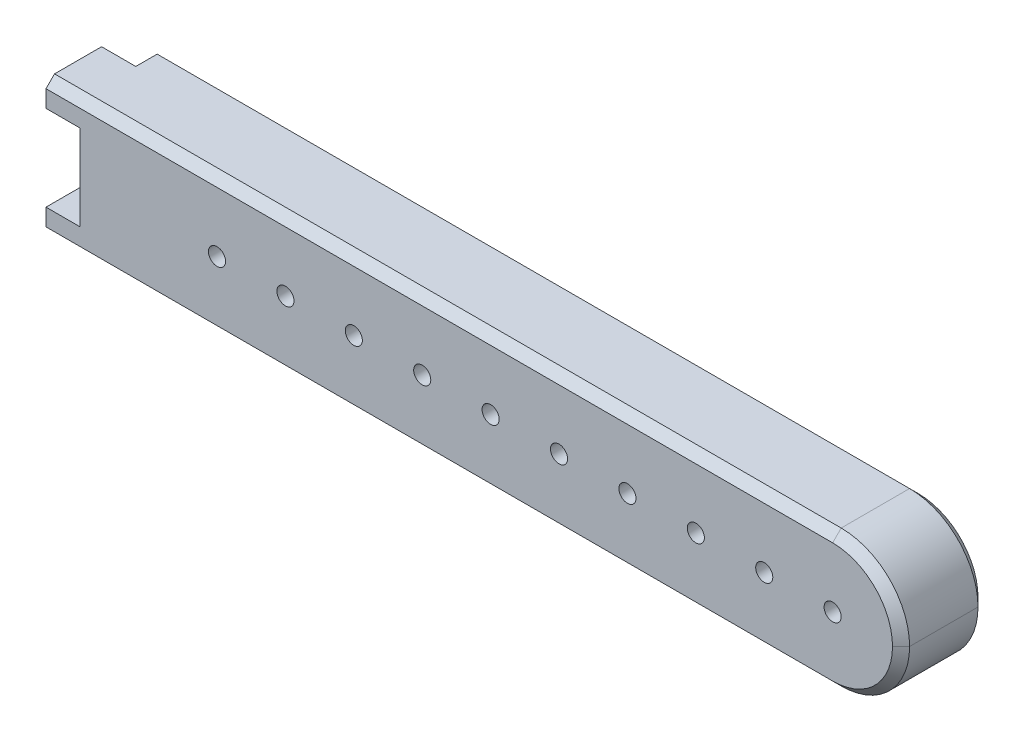
ISO-10303-21;
HEADER;
FILE_DESCRIPTION(('STEP AP214'),'2;1');
FILE_NAME('part.step','',(''),(''),'','','');
FILE_SCHEMA(('AUTOMOTIVE_DESIGN { 1 0 10303 214 1 1 1 1 }'));
ENDSEC;
DATA;
#1=APPLICATION_CONTEXT('core data for automotive mechanical design processes');
#2=APPLICATION_PROTOCOL_DEFINITION('international standard','automotive_design',2000,#1);
#3=PRODUCT_CONTEXT('',#1,'mechanical');
#4=PRODUCT('Part','Part','',(#3));
#5=PRODUCT_RELATED_PRODUCT_CATEGORY('part','',(#4));
#6=PRODUCT_DEFINITION_FORMATION('','',#4);
#7=PRODUCT_DEFINITION_CONTEXT('part definition',#1,'design');
#8=PRODUCT_DEFINITION('design','',#6,#7);
#9=PRODUCT_DEFINITION_SHAPE('','',#8);
#10=(LENGTH_UNIT() NAMED_UNIT(*) SI_UNIT(.MILLI.,.METRE.));
#11=(NAMED_UNIT(*) PLANE_ANGLE_UNIT() SI_UNIT($,.RADIAN.));
#12=(NAMED_UNIT(*) SI_UNIT($,.STERADIAN.) SOLID_ANGLE_UNIT());
#13=UNCERTAINTY_MEASURE_WITH_UNIT(LENGTH_MEASURE(1.E-05),#10,'distance_accuracy_value','');
#14=(GEOMETRIC_REPRESENTATION_CONTEXT(3) GLOBAL_UNCERTAINTY_ASSIGNED_CONTEXT((#13)) GLOBAL_UNIT_ASSIGNED_CONTEXT((#10,
#11,#12)) REPRESENTATION_CONTEXT('',''));
#15=CARTESIAN_POINT('',(0.,0.,0.));
#16=DIRECTION('',(0.,0.,1.));
#17=DIRECTION('',(1.,0.,0.));
#18=AXIS2_PLACEMENT_3D('',#15,#16,#17);
#19=CARTESIAN_POINT('',(0.,0.,0.));
#20=DIRECTION('',(0.,0.,1.));
#21=DIRECTION('',(1.,0.,0.));
#22=AXIS2_PLACEMENT_3D('',#19,#20,#21);
#23=PLANE('',#22);
#24=CARTESIAN_POINT('',(34.,0.,0.));
#25=DIRECTION('',(0.,0.,-1.));
#26=DIRECTION('',(-1.,0.,0.));
#27=AXIS2_PLACEMENT_3D('',#24,#25,#26);
#28=CIRCLE('',#27,0.999999999999998);
#29=CARTESIAN_POINT('',(33.,0.,0.));
#30=VERTEX_POINT('',#29);
#31=EDGE_CURVE('E213',#30,#30,#28,.T.);
#32=ORIENTED_EDGE('',*,*,#31,.F.);
#33=EDGE_LOOP('',(#32));
#34=FACE_BOUND('',#33,.T.);
#35=CARTESIAN_POINT('',(26.,0.,0.));
#36=DIRECTION('',(0.,0.,-1.));
#37=DIRECTION('',(-1.,0.,0.));
#38=AXIS2_PLACEMENT_3D('',#35,#36,#37);
#39=CIRCLE('',#38,1.);
#40=CARTESIAN_POINT('',(25.,0.,0.));
#41=VERTEX_POINT('',#40);
#42=EDGE_CURVE('E219',#41,#41,#39,.T.);
#43=ORIENTED_EDGE('',*,*,#42,.F.);
#44=EDGE_LOOP('',(#43));
#45=FACE_BOUND('',#44,.T.);
#46=CARTESIAN_POINT('',(18.,0.,0.));
#47=DIRECTION('',(0.,0.,-1.));
#48=DIRECTION('',(-1.,0.,0.));
#49=AXIS2_PLACEMENT_3D('',#46,#47,#48);
#50=CIRCLE('',#49,1.);
#51=CARTESIAN_POINT('',(17.,0.,0.));
#52=VERTEX_POINT('',#51);
#53=EDGE_CURVE('E225',#52,#52,#50,.T.);
#54=ORIENTED_EDGE('',*,*,#53,.F.);
#55=EDGE_LOOP('',(#54));
#56=FACE_BOUND('',#55,.T.);
#57=CARTESIAN_POINT('',(9.99999999999999,0.,0.));
#58=DIRECTION('',(0.,0.,-1.));
#59=DIRECTION('',(-1.,0.,0.));
#60=AXIS2_PLACEMENT_3D('',#57,#58,#59);
#61=CIRCLE('',#60,1.);
#62=CARTESIAN_POINT('',(8.99999999999999,0.,0.));
#63=VERTEX_POINT('',#62);
#64=EDGE_CURVE('E231',#63,#63,#61,.T.);
#65=ORIENTED_EDGE('',*,*,#64,.F.);
#66=EDGE_LOOP('',(#65));
#67=FACE_BOUND('',#66,.T.);
#68=CARTESIAN_POINT('',(1.99999999999999,0.,0.));
#69=DIRECTION('',(0.,0.,-1.));
#70=DIRECTION('',(-1.,0.,0.));
#71=AXIS2_PLACEMENT_3D('',#68,#69,#70);
#72=CIRCLE('',#71,1.);
#73=CARTESIAN_POINT('',(0.999999999999993,0.,0.));
#74=VERTEX_POINT('',#73);
#75=EDGE_CURVE('E237',#74,#74,#72,.T.);
#76=ORIENTED_EDGE('',*,*,#75,.F.);
#77=EDGE_LOOP('',(#76));
#78=FACE_BOUND('',#77,.T.);
#79=CARTESIAN_POINT('',(-6.00000000000001,0.,0.));
#80=DIRECTION('',(0.,0.,-1.));
#81=DIRECTION('',(-1.,0.,0.));
#82=AXIS2_PLACEMENT_3D('',#79,#80,#81);
#83=CIRCLE('',#82,1.);
#84=CARTESIAN_POINT('',(-7.00000000000001,0.,0.));
#85=VERTEX_POINT('',#84);
#86=EDGE_CURVE('E243',#85,#85,#83,.T.);
#87=ORIENTED_EDGE('',*,*,#86,.F.);
#88=EDGE_LOOP('',(#87));
#89=FACE_BOUND('',#88,.T.);
#90=CARTESIAN_POINT('',(-14.,0.,0.));
#91=DIRECTION('',(0.,0.,-1.));
#92=DIRECTION('',(-1.,0.,0.));
#93=AXIS2_PLACEMENT_3D('',#90,#91,#92);
#94=CIRCLE('',#93,1.);
#95=CARTESIAN_POINT('',(-15.,0.,0.));
#96=VERTEX_POINT('',#95);
#97=EDGE_CURVE('E249',#96,#96,#94,.T.);
#98=ORIENTED_EDGE('',*,*,#97,.F.);
#99=EDGE_LOOP('',(#98));
#100=FACE_BOUND('',#99,.T.);
#101=CARTESIAN_POINT('',(-22.,0.,0.));
#102=DIRECTION('',(0.,0.,-1.));
#103=DIRECTION('',(-1.,0.,0.));
#104=AXIS2_PLACEMENT_3D('',#101,#102,#103);
#105=CIRCLE('',#104,0.999999999999998);
#106=CARTESIAN_POINT('',(-23.,0.,0.));
#107=VERTEX_POINT('',#106);
#108=EDGE_CURVE('E255',#107,#107,#105,.T.);
#109=ORIENTED_EDGE('',*,*,#108,.F.);
#110=EDGE_LOOP('',(#109));
#111=FACE_BOUND('',#110,.T.);
#112=CARTESIAN_POINT('',(-30.,0.,0.));
#113=DIRECTION('',(0.,0.,-1.));
#114=DIRECTION('',(-1.,0.,0.));
#115=AXIS2_PLACEMENT_3D('',#112,#113,#114);
#116=CIRCLE('',#115,0.999999999999998);
#117=CARTESIAN_POINT('',(-31.,0.,0.));
#118=VERTEX_POINT('',#117);
#119=EDGE_CURVE('E208',#118,#118,#116,.T.);
#120=ORIENTED_EDGE('',*,*,#119,.F.);
#121=EDGE_LOOP('',(#120));
#122=FACE_BOUND('',#121,.T.);
#123=CARTESIAN_POINT('',(42.,0.,0.));
#124=DIRECTION('',(0.,0.,-1.));
#125=DIRECTION('',(-1.,0.,0.));
#126=AXIS2_PLACEMENT_3D('',#123,#124,#125);
#127=CIRCLE('',#126,0.999999999999998);
#128=CARTESIAN_POINT('',(41.,0.,0.));
#129=VERTEX_POINT('',#128);
#130=EDGE_CURVE('E212',#129,#129,#127,.T.);
#131=ORIENTED_EDGE('',*,*,#130,.F.);
#132=EDGE_LOOP('',(#131));
#133=FACE_BOUND('',#132,.T.);
#134=DIRECTION('',(0.,-1.,0.));
#135=VECTOR('',#134,1.);
#136=CARTESIAN_POINT('',(-46.,5.,0.));
#137=LINE('',#136,#135);
#138=CARTESIAN_POINT('',(-46.,7.,0.));
#139=VERTEX_POINT('',#138);
#140=CARTESIAN_POINT('',(-46.,-7.,0.));
#141=VERTEX_POINT('',#140);
#142=EDGE_CURVE('E279',#139,#141,#137,.T.);
#143=ORIENTED_EDGE('',*,*,#142,.F.);
#144=DIRECTION('',(1.,0.,0.));
#145=VECTOR('',#144,1.);
#146=CARTESIAN_POINT('',(0.,7.,0.));
#147=LINE('',#146,#145);
#148=CARTESIAN_POINT('',(42.,7.,0.));
#149=VERTEX_POINT('',#148);
#150=EDGE_CURVE('E327',#139,#149,#147,.T.);
#151=ORIENTED_EDGE('',*,*,#150,.T.);
#152=CARTESIAN_POINT('',(42.,0.,0.));
#153=DIRECTION('',(0.,0.,1.));
#154=DIRECTION('',(1.,0.,0.));
#155=AXIS2_PLACEMENT_3D('',#152,#153,#154);
#156=CIRCLE('',#155,7.);
#157=CARTESIAN_POINT('',(49.,0.,0.));
#158=VERTEX_POINT('',#157);
#159=EDGE_CURVE('E325',#149,#158,#156,.F.);
#160=ORIENTED_EDGE('',*,*,#159,.T.);
#161=CARTESIAN_POINT('',(42.,0.,0.));
#162=DIRECTION('',(0.,0.,1.));
#163=DIRECTION('',(1.,0.,0.));
#164=AXIS2_PLACEMENT_3D('',#161,#162,#163);
#165=CIRCLE('',#164,7.);
#166=CARTESIAN_POINT('',(42.,-7.,0.));
#167=VERTEX_POINT('',#166);
#168=EDGE_CURVE('E323',#158,#167,#165,.F.);
#169=ORIENTED_EDGE('',*,*,#168,.T.);
#170=DIRECTION('',(-1.,0.,0.));
#171=VECTOR('',#170,1.);
#172=CARTESIAN_POINT('',(0.,-7.,0.));
#173=LINE('',#172,#171);
#174=EDGE_CURVE('E320',#167,#141,#173,.T.);
#175=ORIENTED_EDGE('',*,*,#174,.T.);
#176=EDGE_LOOP('',(#143,#151,#160,#169,#175));
#177=FACE_BOUND('',#176,.T.);
#178=ADVANCED_FACE('F43',(#34,#45,#56,#67,#78,#89,#100,#111,#122,#133,#177),#23,.F.);
#179=CARTESIAN_POINT('',(-50.,-8.,1.));
#180=DIRECTION('',(0.,0.707106781186547,0.707106781186547));
#181=DIRECTION('',(1.,0.,0.));
#182=AXIS2_PLACEMENT_3D('',#179,#180,#181);
#183=PLANE('',#182);
#184=DIRECTION('',(1.,0.,0.));
#185=VECTOR('',#184,1.);
#186=CARTESIAN_POINT('',(-50.,-8.,1.));
#187=LINE('',#186,#185);
#188=CARTESIAN_POINT('',(-46.,-8.,1.));
#189=VERTEX_POINT('',#188);
#190=CARTESIAN_POINT('',(42.,-8.,1.));
#191=VERTEX_POINT('',#190);
#192=EDGE_CURVE('E339',#189,#191,#187,.T.);
#193=ORIENTED_EDGE('',*,*,#192,.F.);
#194=DIRECTION('',(0.,-0.707106781186548,0.707106781186548));
#195=VECTOR('',#194,1.);
#196=CARTESIAN_POINT('',(-46.,-8.,1.));
#197=LINE('',#196,#195);
#198=EDGE_CURVE('E204',#189,#141,#197,.F.);
#199=ORIENTED_EDGE('',*,*,#198,.T.);
#200=ORIENTED_EDGE('',*,*,#174,.F.);
#201=DIRECTION('',(0.,0.707106781186547,-0.707106781186547));
#202=VECTOR('',#201,1.);
#203=CARTESIAN_POINT('',(42.,-8.,1.));
#204=LINE('',#203,#202);
#205=EDGE_CURVE('E315',#191,#167,#204,.T.);
#206=ORIENTED_EDGE('',*,*,#205,.F.);
#207=EDGE_LOOP('',(#193,#199,#200,#206));
#208=FACE_BOUND('',#207,.T.);
#209=ADVANCED_FACE('F436',(#208),#183,.F.);
#210=CARTESIAN_POINT('',(-50.,8.,1.));
#211=DIRECTION('',(0.,-0.707106781186547,0.707106781186547));
#212=DIRECTION('',(-1.,0.,0.));
#213=AXIS2_PLACEMENT_3D('',#210,#211,#212);
#214=PLANE('',#213);
#215=ORIENTED_EDGE('',*,*,#150,.F.);
#216=DIRECTION('',(0.,-0.707106781186548,-0.707106781186548));
#217=VECTOR('',#216,1.);
#218=CARTESIAN_POINT('',(-46.,8.,1.));
#219=LINE('',#218,#217);
#220=CARTESIAN_POINT('',(-46.,8.,1.));
#221=VERTEX_POINT('',#220);
#222=EDGE_CURVE('E352',#139,#221,#219,.F.);
#223=ORIENTED_EDGE('',*,*,#222,.T.);
#224=DIRECTION('',(-1.,0.,0.));
#225=VECTOR('',#224,1.);
#226=CARTESIAN_POINT('',(-50.,8.,1.));
#227=LINE('',#226,#225);
#228=CARTESIAN_POINT('',(42.,8.,1.));
#229=VERTEX_POINT('',#228);
#230=EDGE_CURVE('E199',#229,#221,#227,.T.);
#231=ORIENTED_EDGE('',*,*,#230,.F.);
#232=DIRECTION('',(0.,-0.707106781186547,-0.707106781186547));
#233=VECTOR('',#232,1.);
#234=CARTESIAN_POINT('',(42.,8.,1.));
#235=LINE('',#234,#233);
#236=EDGE_CURVE('E353',#229,#149,#235,.T.);
#237=ORIENTED_EDGE('',*,*,#236,.T.);
#238=EDGE_LOOP('',(#215,#223,#231,#237));
#239=FACE_BOUND('',#238,.T.);
#240=ADVANCED_FACE('F430',(#239),#214,.F.);
#241=CARTESIAN_POINT('',(-50.,8.,10.));
#242=DIRECTION('',(1.,0.,0.));
#243=DIRECTION('',(0.,0.,-1.));
#244=AXIS2_PLACEMENT_3D('',#241,#242,#243);
#245=PLANE('',#244);
#246=DIRECTION('',(0.,1.,0.));
#247=VECTOR('',#246,1.);
#248=CARTESIAN_POINT('',(-50.,-8.,3.5));
#249=LINE('',#248,#247);
#250=CARTESIAN_POINT('',(-50.,7.,3.5));
#251=VERTEX_POINT('',#250);
#252=CARTESIAN_POINT('',(-50.,8.,3.5));
#253=VERTEX_POINT('',#252);
#254=EDGE_CURVE('E188',#251,#253,#249,.T.);
#255=ORIENTED_EDGE('',*,*,#254,.F.);
#256=CARTESIAN_POINT('',(-50.,7.,5.5));
#257=DIRECTION('',(1.,0.,0.));
#258=DIRECTION('',(0.,0.,-1.));
#259=AXIS2_PLACEMENT_3D('',#256,#257,#258);
#260=CIRCLE('',#259,2.);
#261=CARTESIAN_POINT('',(-50.,5.,5.5));
#262=VERTEX_POINT('',#261);
#263=EDGE_CURVE('E375',#251,#262,#260,.F.);
#264=ORIENTED_EDGE('',*,*,#263,.T.);
#265=DIRECTION('',(0.,0.,-1.));
#266=VECTOR('',#265,1.);
#267=CARTESIAN_POINT('',(-50.,5.,10.));
#268=LINE('',#267,#266);
#269=CARTESIAN_POINT('',(-50.,5.,10.));
#270=VERTEX_POINT('',#269);
#271=EDGE_CURVE('E304',#270,#262,#268,.T.);
#272=ORIENTED_EDGE('',*,*,#271,.F.);
#273=DIRECTION('',(0.,-1.,0.));
#274=VECTOR('',#273,1.);
#275=CARTESIAN_POINT('',(-50.,8.,10.));
#276=LINE('',#275,#274);
#277=CARTESIAN_POINT('',(-50.,7.00000000000002,10.));
#278=VERTEX_POINT('',#277);
#279=EDGE_CURVE('E280',#278,#270,#276,.T.);
#280=ORIENTED_EDGE('',*,*,#279,.F.);
#281=DIRECTION('',(0.,0.707106781186548,-0.707106781186548));
#282=VECTOR('',#281,1.);
#283=CARTESIAN_POINT('',(-50.,7.00000000000002,10.));
#284=LINE('',#283,#282);
#285=CARTESIAN_POINT('',(-50.,8.,9.00000000000001));
#286=VERTEX_POINT('',#285);
#287=EDGE_CURVE('E318',#278,#286,#284,.T.);
#288=ORIENTED_EDGE('',*,*,#287,.T.);
#289=DIRECTION('',(0.,0.,-1.));
#290=VECTOR('',#289,1.);
#291=CARTESIAN_POINT('',(-50.,8.,10.));
#292=LINE('',#291,#290);
#293=EDGE_CURVE('E291',#286,#253,#292,.T.);
#294=ORIENTED_EDGE('',*,*,#293,.T.);
#295=EDGE_LOOP('',(#255,#264,#272,#280,#288,#294));
#296=FACE_BOUND('',#295,.T.);
#297=ADVANCED_FACE('F416',(#296),#245,.F.);
#298=CARTESIAN_POINT('',(-50.,5.,10.));
#299=DIRECTION('',(0.,1.,0.));
#300=DIRECTION('',(0.,0.,1.));
#301=AXIS2_PLACEMENT_3D('',#298,#299,#300);
#302=PLANE('',#301);
#303=ORIENTED_EDGE('',*,*,#271,.T.);
#304=DIRECTION('',(1.,0.,0.));
#305=VECTOR('',#304,1.);
#306=CARTESIAN_POINT('',(-50.,5.,5.5));
#307=LINE('',#306,#305);
#308=CARTESIAN_POINT('',(-46.,5.,5.5));
#309=VERTEX_POINT('',#308);
#310=EDGE_CURVE('E370',#262,#309,#307,.T.);
#311=ORIENTED_EDGE('',*,*,#310,.T.);
#312=DIRECTION('',(0.,0.,-1.));
#313=VECTOR('',#312,1.);
#314=CARTESIAN_POINT('',(-46.,5.,10.));
#315=LINE('',#314,#313);
#316=CARTESIAN_POINT('',(-46.,5.,10.));
#317=VERTEX_POINT('',#316);
#318=EDGE_CURVE('E302',#317,#309,#315,.T.);
#319=ORIENTED_EDGE('',*,*,#318,.F.);
#320=DIRECTION('',(1.,0.,0.));
#321=VECTOR('',#320,1.);
#322=CARTESIAN_POINT('',(-50.,5.,10.));
#323=LINE('',#322,#321);
#324=EDGE_CURVE('E282',#270,#317,#323,.T.);
#325=ORIENTED_EDGE('',*,*,#324,.F.);
#326=EDGE_LOOP('',(#303,#311,#319,#325));
#327=FACE_BOUND('',#326,.T.);
#328=ADVANCED_FACE('F453',(#327),#302,.F.);
#329=CARTESIAN_POINT('',(-46.,5.,10.));
#330=DIRECTION('',(1.,0.,0.));
#331=DIRECTION('',(0.,0.,-1.));
#332=AXIS2_PLACEMENT_3D('',#329,#330,#331);
#333=PLANE('',#332);
#334=CARTESIAN_POINT('',(-46.,0.,5.));
#335=DIRECTION('',(-1.,0.,0.));
#336=DIRECTION('',(0.,0.,1.));
#337=AXIS2_PLACEMENT_3D('',#334,#335,#336);
#338=CIRCLE('',#337,2.025);
#339=CARTESIAN_POINT('',(-46.,0.,7.025));
#340=VERTEX_POINT('',#339);
#341=EDGE_CURVE('E269',#340,#340,#338,.T.);
#342=ORIENTED_EDGE('',*,*,#341,.F.);
#343=EDGE_LOOP('',(#342));
#344=FACE_BOUND('',#343,.T.);
#345=ORIENTED_EDGE('',*,*,#318,.T.);
#346=CARTESIAN_POINT('',(-46.,7.,5.5));
#347=DIRECTION('',(1.,0.,0.));
#348=DIRECTION('',(0.,0.,-1.));
#349=AXIS2_PLACEMENT_3D('',#346,#347,#348);
#350=CIRCLE('',#349,2.);
#351=CARTESIAN_POINT('',(-46.,7.,3.5));
#352=VERTEX_POINT('',#351);
#353=EDGE_CURVE('E51',#309,#352,#350,.T.);
#354=ORIENTED_EDGE('',*,*,#353,.T.);
#355=DIRECTION('',(0.,1.,0.));
#356=VECTOR('',#355,1.);
#357=CARTESIAN_POINT('',(-46.,-8.,3.5));
#358=LINE('',#357,#356);
#359=CARTESIAN_POINT('',(-46.,8.,3.5));
#360=VERTEX_POINT('',#359);
#361=EDGE_CURVE('E171',#352,#360,#358,.T.);
#362=ORIENTED_EDGE('',*,*,#361,.T.);
#363=DIRECTION('',(0.,0.,-1.));
#364=VECTOR('',#363,1.);
#365=CARTESIAN_POINT('',(-46.,8.,3.5));
#366=LINE('',#365,#364);
#367=EDGE_CURVE('E177',#360,#221,#366,.T.);
#368=ORIENTED_EDGE('',*,*,#367,.T.);
#369=ORIENTED_EDGE('',*,*,#222,.F.);
#370=ORIENTED_EDGE('',*,*,#142,.T.);
#371=ORIENTED_EDGE('',*,*,#198,.F.);
#372=DIRECTION('',(0.,0.,1.));
#373=VECTOR('',#372,1.);
#374=CARTESIAN_POINT('',(-46.,-8.,3.5));
#375=LINE('',#374,#373);
#376=CARTESIAN_POINT('',(-46.,-8.,3.5));
#377=VERTEX_POINT('',#376);
#378=EDGE_CURVE('E193',#189,#377,#375,.T.);
#379=ORIENTED_EDGE('',*,*,#378,.T.);
#380=CARTESIAN_POINT('',(-46.,-7.,3.5));
#381=VERTEX_POINT('',#380);
#382=EDGE_CURVE('E181',#377,#381,#358,.T.);
#383=ORIENTED_EDGE('',*,*,#382,.T.);
#384=CARTESIAN_POINT('',(-46.,-7.,5.5));
#385=DIRECTION('',(1.,0.,0.));
#386=DIRECTION('',(0.,0.,-1.));
#387=AXIS2_PLACEMENT_3D('',#384,#385,#386);
#388=CIRCLE('',#387,2.);
#389=CARTESIAN_POINT('',(-46.,-5.,5.5));
#390=VERTEX_POINT('',#389);
#391=EDGE_CURVE('E11',#381,#390,#388,.T.);
#392=ORIENTED_EDGE('',*,*,#391,.T.);
#393=DIRECTION('',(0.,0.,-1.));
#394=VECTOR('',#393,1.);
#395=CARTESIAN_POINT('',(-46.,-5.,10.));
#396=LINE('',#395,#394);
#397=CARTESIAN_POINT('',(-46.,-5.,10.));
#398=VERTEX_POINT('',#397);
#399=EDGE_CURVE('E299',#398,#390,#396,.T.);
#400=ORIENTED_EDGE('',*,*,#399,.F.);
#401=DIRECTION('',(0.,-1.,0.));
#402=VECTOR('',#401,1.);
#403=CARTESIAN_POINT('',(-46.,5.,10.));
#404=LINE('',#403,#402);
#405=EDGE_CURVE('E284',#317,#398,#404,.T.);
#406=ORIENTED_EDGE('',*,*,#405,.F.);
#407=EDGE_LOOP('',(#345,#354,#362,#368,#369,#370,#371,#379,#383,#392,#400,#406));
#408=FACE_BOUND('',#407,.T.);
#409=ADVANCED_FACE('F174',(#344,#408),#333,.F.);
#410=CARTESIAN_POINT('',(-50.,-5.,10.));
#411=DIRECTION('',(0.,-1.,0.));
#412=DIRECTION('',(0.,0.,-1.));
#413=AXIS2_PLACEMENT_3D('',#410,#411,#412);
#414=PLANE('',#413);
#415=ORIENTED_EDGE('',*,*,#399,.T.);
#416=DIRECTION('',(-1.,0.,0.));
#417=VECTOR('',#416,1.);
#418=CARTESIAN_POINT('',(-50.,-5.,5.5));
#419=LINE('',#418,#417);
#420=CARTESIAN_POINT('',(-50.,-5.,5.5));
#421=VERTEX_POINT('',#420);
#422=EDGE_CURVE('E377',#390,#421,#419,.T.);
#423=ORIENTED_EDGE('',*,*,#422,.T.);
#424=DIRECTION('',(0.,0.,-1.));
#425=VECTOR('',#424,1.);
#426=CARTESIAN_POINT('',(-50.,-5.,10.));
#427=LINE('',#426,#425);
#428=CARTESIAN_POINT('',(-50.,-5.,10.));
#429=VERTEX_POINT('',#428);
#430=EDGE_CURVE('E297',#429,#421,#427,.T.);
#431=ORIENTED_EDGE('',*,*,#430,.F.);
#432=DIRECTION('',(-1.,0.,0.));
#433=VECTOR('',#432,1.);
#434=CARTESIAN_POINT('',(-50.,-5.,10.));
#435=LINE('',#434,#433);
#436=EDGE_CURVE('E286',#398,#429,#435,.T.);
#437=ORIENTED_EDGE('',*,*,#436,.F.);
#438=EDGE_LOOP('',(#415,#423,#431,#437));
#439=FACE_BOUND('',#438,.T.);
#440=ADVANCED_FACE('F384',(#439),#414,.F.);
#441=CARTESIAN_POINT('',(-50.,-5.,10.));
#442=DIRECTION('',(1.,0.,0.));
#443=DIRECTION('',(0.,0.,-1.));
#444=AXIS2_PLACEMENT_3D('',#441,#442,#443);
#445=PLANE('',#444);
#446=ORIENTED_EDGE('',*,*,#430,.T.);
#447=CARTESIAN_POINT('',(-50.,-7.,5.5));
#448=DIRECTION('',(1.,0.,0.));
#449=DIRECTION('',(0.,0.,-1.));
#450=AXIS2_PLACEMENT_3D('',#447,#448,#449);
#451=CIRCLE('',#450,2.);
#452=CARTESIAN_POINT('',(-50.,-7.,3.5));
#453=VERTEX_POINT('',#452);
#454=EDGE_CURVE('E66',#421,#453,#451,.F.);
#455=ORIENTED_EDGE('',*,*,#454,.T.);
#456=CARTESIAN_POINT('',(-50.,-8.,3.5));
#457=VERTEX_POINT('',#456);
#458=EDGE_CURVE('E182',#457,#453,#249,.T.);
#459=ORIENTED_EDGE('',*,*,#458,.F.);
#460=DIRECTION('',(0.,0.,-1.));
#461=VECTOR('',#460,1.);
#462=CARTESIAN_POINT('',(-50.,-8.,10.));
#463=LINE('',#462,#461);
#464=CARTESIAN_POINT('',(-50.,-8.,9.00000000000001));
#465=VERTEX_POINT('',#464);
#466=EDGE_CURVE('E294',#465,#457,#463,.T.);
#467=ORIENTED_EDGE('',*,*,#466,.F.);
#468=DIRECTION('',(0.,0.707106781186548,0.707106781186548));
#469=VECTOR('',#468,1.);
#470=CARTESIAN_POINT('',(-50.,-7.00000000000001,10.));
#471=LINE('',#470,#469);
#472=CARTESIAN_POINT('',(-50.,-7.00000000000001,10.));
#473=VERTEX_POINT('',#472);
#474=EDGE_CURVE('E341',#465,#473,#471,.T.);
#475=ORIENTED_EDGE('',*,*,#474,.T.);
#476=DIRECTION('',(0.,-1.,0.));
#477=VECTOR('',#476,1.);
#478=CARTESIAN_POINT('',(-50.,-5.,10.));
#479=LINE('',#478,#477);
#480=EDGE_CURVE('E288',#429,#473,#479,.T.);
#481=ORIENTED_EDGE('',*,*,#480,.F.);
#482=EDGE_LOOP('',(#446,#455,#459,#467,#475,#481));
#483=FACE_BOUND('',#482,.T.);
#484=ADVANCED_FACE('F390',(#483),#445,.F.);
#485=CARTESIAN_POINT('',(-50.,-8.,10.));
#486=DIRECTION('',(0.,1.,0.));
#487=DIRECTION('',(0.,0.,1.));
#488=AXIS2_PLACEMENT_3D('',#485,#486,#487);
#489=PLANE('',#488);
#490=ORIENTED_EDGE('',*,*,#466,.T.);
#491=DIRECTION('',(-1.,0.,0.));
#492=VECTOR('',#491,1.);
#493=CARTESIAN_POINT('',(-46.,-8.,3.5));
#494=LINE('',#493,#492);
#495=EDGE_CURVE('E192',#377,#457,#494,.T.);
#496=ORIENTED_EDGE('',*,*,#495,.F.);
#497=ORIENTED_EDGE('',*,*,#378,.F.);
#498=ORIENTED_EDGE('',*,*,#192,.T.);
#499=DIRECTION('',(0.,0.,-1.));
#500=VECTOR('',#499,1.);
#501=CARTESIAN_POINT('',(42.,-8.,10.));
#502=LINE('',#501,#500);
#503=CARTESIAN_POINT('',(42.,-8.,9.00000000000001));
#504=VERTEX_POINT('',#503);
#505=EDGE_CURVE('E309',#191,#504,#502,.F.);
#506=ORIENTED_EDGE('',*,*,#505,.T.);
#507=DIRECTION('',(-1.,0.,0.));
#508=VECTOR('',#507,1.);
#509=CARTESIAN_POINT('',(-50.,-8.,9.00000000000001));
#510=LINE('',#509,#508);
#511=EDGE_CURVE('E337',#504,#465,#510,.T.);
#512=ORIENTED_EDGE('',*,*,#511,.T.);
#513=EDGE_LOOP('',(#490,#496,#497,#498,#506,#512));
#514=FACE_BOUND('',#513,.T.);
#515=ADVANCED_FACE('F446',(#514),#489,.F.);
#516=CARTESIAN_POINT('',(-50.,8.,10.));
#517=DIRECTION('',(0.,-1.,0.));
#518=DIRECTION('',(0.,0.,-1.));
#519=AXIS2_PLACEMENT_3D('',#516,#517,#518);
#520=PLANE('',#519);
#521=ORIENTED_EDGE('',*,*,#367,.F.);
#522=DIRECTION('',(-1.,0.,0.));
#523=VECTOR('',#522,1.);
#524=CARTESIAN_POINT('',(-46.,8.,3.5));
#525=LINE('',#524,#523);
#526=EDGE_CURVE('E185',#360,#253,#525,.T.);
#527=ORIENTED_EDGE('',*,*,#526,.T.);
#528=ORIENTED_EDGE('',*,*,#293,.F.);
#529=DIRECTION('',(1.,0.,0.));
#530=VECTOR('',#529,1.);
#531=CARTESIAN_POINT('',(42.,8.,9.00000000000001));
#532=LINE('',#531,#530);
#533=CARTESIAN_POINT('',(42.,8.,9.00000000000001));
#534=VERTEX_POINT('',#533);
#535=EDGE_CURVE('E312',#286,#534,#532,.T.);
#536=ORIENTED_EDGE('',*,*,#535,.T.);
#537=DIRECTION('',(0.,0.,-1.));
#538=VECTOR('',#537,1.);
#539=CARTESIAN_POINT('',(42.,8.,10.));
#540=LINE('',#539,#538);
#541=EDGE_CURVE('E307',#534,#229,#540,.T.);
#542=ORIENTED_EDGE('',*,*,#541,.T.);
#543=ORIENTED_EDGE('',*,*,#230,.T.);
#544=EDGE_LOOP('',(#521,#527,#528,#536,#542,#543));
#545=FACE_BOUND('',#544,.T.);
#546=ADVANCED_FACE('F196',(#545),#520,.F.);
#547=CARTESIAN_POINT('',(0.,0.,10.));
#548=DIRECTION('',(0.,0.,1.));
#549=DIRECTION('',(1.,0.,0.));
#550=AXIS2_PLACEMENT_3D('',#547,#548,#549);
#551=PLANE('',#550);
#552=CARTESIAN_POINT('',(34.,0.,10.));
#553=DIRECTION('',(0.,0.,-1.));
#554=DIRECTION('',(-1.,0.,0.));
#555=AXIS2_PLACEMENT_3D('',#552,#553,#554);
#556=CIRCLE('',#555,0.999999999999998);
#557=CARTESIAN_POINT('',(33.,0.,10.));
#558=VERTEX_POINT('',#557);
#559=EDGE_CURVE('E209',#558,#558,#556,.T.);
#560=ORIENTED_EDGE('',*,*,#559,.T.);
#561=EDGE_LOOP('',(#560));
#562=FACE_BOUND('',#561,.T.);
#563=CARTESIAN_POINT('',(26.,0.,10.));
#564=DIRECTION('',(0.,0.,-1.));
#565=DIRECTION('',(-1.,0.,0.));
#566=AXIS2_PLACEMENT_3D('',#563,#564,#565);
#567=CIRCLE('',#566,1.);
#568=CARTESIAN_POINT('',(25.,0.,10.));
#569=VERTEX_POINT('',#568);
#570=EDGE_CURVE('E216',#569,#569,#567,.T.);
#571=ORIENTED_EDGE('',*,*,#570,.T.);
#572=EDGE_LOOP('',(#571));
#573=FACE_BOUND('',#572,.T.);
#574=CARTESIAN_POINT('',(18.,0.,10.));
#575=DIRECTION('',(0.,0.,-1.));
#576=DIRECTION('',(-1.,0.,0.));
#577=AXIS2_PLACEMENT_3D('',#574,#575,#576);
#578=CIRCLE('',#577,1.);
#579=CARTESIAN_POINT('',(17.,0.,10.));
#580=VERTEX_POINT('',#579);
#581=EDGE_CURVE('E222',#580,#580,#578,.T.);
#582=ORIENTED_EDGE('',*,*,#581,.T.);
#583=EDGE_LOOP('',(#582));
#584=FACE_BOUND('',#583,.T.);
#585=CARTESIAN_POINT('',(9.99999999999999,0.,10.));
#586=DIRECTION('',(0.,0.,-1.));
#587=DIRECTION('',(-1.,0.,0.));
#588=AXIS2_PLACEMENT_3D('',#585,#586,#587);
#589=CIRCLE('',#588,1.);
#590=CARTESIAN_POINT('',(8.99999999999999,0.,10.));
#591=VERTEX_POINT('',#590);
#592=EDGE_CURVE('E228',#591,#591,#589,.T.);
#593=ORIENTED_EDGE('',*,*,#592,.T.);
#594=EDGE_LOOP('',(#593));
#595=FACE_BOUND('',#594,.T.);
#596=CARTESIAN_POINT('',(1.99999999999999,0.,10.));
#597=DIRECTION('',(0.,0.,-1.));
#598=DIRECTION('',(-1.,0.,0.));
#599=AXIS2_PLACEMENT_3D('',#596,#597,#598);
#600=CIRCLE('',#599,1.);
#601=CARTESIAN_POINT('',(0.999999999999993,0.,10.));
#602=VERTEX_POINT('',#601);
#603=EDGE_CURVE('E234',#602,#602,#600,.T.);
#604=ORIENTED_EDGE('',*,*,#603,.T.);
#605=EDGE_LOOP('',(#604));
#606=FACE_BOUND('',#605,.T.);
#607=CARTESIAN_POINT('',(-6.00000000000001,0.,10.));
#608=DIRECTION('',(0.,0.,-1.));
#609=DIRECTION('',(-1.,0.,0.));
#610=AXIS2_PLACEMENT_3D('',#607,#608,#609);
#611=CIRCLE('',#610,1.);
#612=CARTESIAN_POINT('',(-7.00000000000001,0.,10.));
#613=VERTEX_POINT('',#612);
#614=EDGE_CURVE('E240',#613,#613,#611,.T.);
#615=ORIENTED_EDGE('',*,*,#614,.T.);
#616=EDGE_LOOP('',(#615));
#617=FACE_BOUND('',#616,.T.);
#618=CARTESIAN_POINT('',(-14.,0.,10.));
#619=DIRECTION('',(0.,0.,-1.));
#620=DIRECTION('',(-1.,0.,0.));
#621=AXIS2_PLACEMENT_3D('',#618,#619,#620);
#622=CIRCLE('',#621,1.);
#623=CARTESIAN_POINT('',(-15.,0.,10.));
#624=VERTEX_POINT('',#623);
#625=EDGE_CURVE('E246',#624,#624,#622,.T.);
#626=ORIENTED_EDGE('',*,*,#625,.T.);
#627=EDGE_LOOP('',(#626));
#628=FACE_BOUND('',#627,.T.);
#629=CARTESIAN_POINT('',(-22.,0.,10.));
#630=DIRECTION('',(0.,0.,-1.));
#631=DIRECTION('',(-1.,0.,0.));
#632=AXIS2_PLACEMENT_3D('',#629,#630,#631);
#633=CIRCLE('',#632,0.999999999999998);
#634=CARTESIAN_POINT('',(-23.,0.,10.));
#635=VERTEX_POINT('',#634);
#636=EDGE_CURVE('E252',#635,#635,#633,.T.);
#637=ORIENTED_EDGE('',*,*,#636,.T.);
#638=EDGE_LOOP('',(#637));
#639=FACE_BOUND('',#638,.T.);
#640=CARTESIAN_POINT('',(-30.,0.,10.));
#641=DIRECTION('',(0.,0.,-1.));
#642=DIRECTION('',(-1.,0.,0.));
#643=AXIS2_PLACEMENT_3D('',#640,#641,#642);
#644=CIRCLE('',#643,0.999999999999998);
#645=CARTESIAN_POINT('',(-31.,0.,10.));
#646=VERTEX_POINT('',#645);
#647=EDGE_CURVE('E258',#646,#646,#644,.T.);
#648=ORIENTED_EDGE('',*,*,#647,.T.);
#649=EDGE_LOOP('',(#648));
#650=FACE_BOUND('',#649,.T.);
#651=CARTESIAN_POINT('',(42.,0.,10.));
#652=DIRECTION('',(0.,0.,-1.));
#653=DIRECTION('',(-1.,0.,0.));
#654=AXIS2_PLACEMENT_3D('',#651,#652,#653);
#655=CIRCLE('',#654,0.999999999999998);
#656=CARTESIAN_POINT('',(41.,0.,10.));
#657=VERTEX_POINT('',#656);
#658=EDGE_CURVE('E263',#657,#657,#655,.T.);
#659=ORIENTED_EDGE('',*,*,#658,.T.);
#660=EDGE_LOOP('',(#659));
#661=FACE_BOUND('',#660,.T.);
#662=CARTESIAN_POINT('',(42.,0.,10.));
#663=DIRECTION('',(0.,0.,1.));
#664=DIRECTION('',(1.,0.,0.));
#665=AXIS2_PLACEMENT_3D('',#662,#663,#664);
#666=CIRCLE('',#665,7.00000000000001);
#667=CARTESIAN_POINT('',(49.,0.,10.));
#668=VERTEX_POINT('',#667);
#669=CARTESIAN_POINT('',(42.,7.00000000000002,10.));
#670=VERTEX_POINT('',#669);
#671=EDGE_CURVE('E347',#668,#670,#666,.T.);
#672=ORIENTED_EDGE('',*,*,#671,.T.);
#673=DIRECTION('',(-1.,0.,0.));
#674=VECTOR('',#673,1.);
#675=CARTESIAN_POINT('',(-50.,7.00000000000002,10.));
#676=LINE('',#675,#674);
#677=EDGE_CURVE('E349',#670,#278,#676,.T.);
#678=ORIENTED_EDGE('',*,*,#677,.T.);
#679=ORIENTED_EDGE('',*,*,#279,.T.);
#680=ORIENTED_EDGE('',*,*,#324,.T.);
#681=ORIENTED_EDGE('',*,*,#405,.T.);
#682=ORIENTED_EDGE('',*,*,#436,.T.);
#683=ORIENTED_EDGE('',*,*,#480,.T.);
#684=DIRECTION('',(1.,0.,0.));
#685=VECTOR('',#684,1.);
#686=CARTESIAN_POINT('',(42.,-7.00000000000001,10.));
#687=LINE('',#686,#685);
#688=CARTESIAN_POINT('',(42.,-7.00000000000001,10.));
#689=VERTEX_POINT('',#688);
#690=EDGE_CURVE('E343',#473,#689,#687,.T.);
#691=ORIENTED_EDGE('',*,*,#690,.T.);
#692=CARTESIAN_POINT('',(42.,0.,10.));
#693=DIRECTION('',(0.,0.,1.));
#694=DIRECTION('',(1.,0.,0.));
#695=AXIS2_PLACEMENT_3D('',#692,#693,#694);
#696=CIRCLE('',#695,7.00000000000001);
#697=EDGE_CURVE('E345',#689,#668,#696,.T.);
#698=ORIENTED_EDGE('',*,*,#697,.T.);
#699=EDGE_LOOP('',(#672,#678,#679,#680,#681,#682,#683,#691,#698));
#700=FACE_BOUND('',#699,.T.);
#701=ADVANCED_FACE('F395',(#562,#573,#584,#595,#606,#617,#628,#639,#650,#661,#700),#551,.T.);
#702=CARTESIAN_POINT('',(-35.9,0.,5.));
#703=DIRECTION('',(-1.,0.,0.));
#704=DIRECTION('',(0.,0.,1.));
#705=AXIS2_PLACEMENT_3D('',#702,#703,#704);
#706=CONICAL_SURFACE('',#705,1.64999999999999,1.02974425867665);
#707=CARTESIAN_POINT('',(-34.9085799786045,0.,5.));
#708=VERTEX_POINT('',#707);
#709=VERTEX_LOOP('',#708);
#710=FACE_BOUND('',#709,.T.);
#711=CARTESIAN_POINT('',(-35.9,0.,5.));
#712=DIRECTION('',(-1.,0.,0.));
#713=DIRECTION('',(0.,0.,1.));
#714=AXIS2_PLACEMENT_3D('',#711,#712,#713);
#715=CIRCLE('',#714,1.64999999999999);
#716=CARTESIAN_POINT('',(-35.9,0.,6.64999999999999));
#717=VERTEX_POINT('',#716);
#718=EDGE_CURVE('E276',#717,#717,#715,.T.);
#719=ORIENTED_EDGE('',*,*,#718,.T.);
#720=EDGE_LOOP('',(#719));
#721=FACE_BOUND('',#720,.T.);
#722=ADVANCED_FACE('F723',(#710,#721),#706,.F.);
#723=CARTESIAN_POINT('',(-46.,0.,5.));
#724=DIRECTION('',(-1.,0.,0.));
#725=DIRECTION('',(0.,0.,1.));
#726=AXIS2_PLACEMENT_3D('',#723,#724,#725);
#727=CYLINDRICAL_SURFACE('',#726,1.64999999999999);
#728=ORIENTED_EDGE('',*,*,#718,.F.);
#729=EDGE_LOOP('',(#728));
#730=FACE_BOUND('',#729,.T.);
#731=CARTESIAN_POINT('',(-45.625,0.,5.));
#732=DIRECTION('',(-1.,0.,0.));
#733=DIRECTION('',(0.,0.,1.));
#734=AXIS2_PLACEMENT_3D('',#731,#732,#733);
#735=CIRCLE('',#734,1.65);
#736=CARTESIAN_POINT('',(-45.625,0.,6.65));
#737=VERTEX_POINT('',#736);
#738=EDGE_CURVE('E272',#737,#737,#735,.T.);
#739=ORIENTED_EDGE('',*,*,#738,.T.);
#740=EDGE_LOOP('',(#739));
#741=FACE_BOUND('',#740,.T.);
#742=ADVANCED_FACE('F713',(#730,#741),#727,.F.);
#743=CARTESIAN_POINT('',(-46.,0.,5.));
#744=DIRECTION('',(-1.,0.,0.));
#745=DIRECTION('',(0.,0.,1.));
#746=AXIS2_PLACEMENT_3D('',#743,#744,#745);
#747=CONICAL_SURFACE('',#746,2.025,0.785398163397449);
#748=ORIENTED_EDGE('',*,*,#738,.F.);
#749=EDGE_LOOP('',(#748));
#750=FACE_BOUND('',#749,.T.);
#751=ORIENTED_EDGE('',*,*,#341,.T.);
#752=EDGE_LOOP('',(#751));
#753=FACE_BOUND('',#752,.T.);
#754=ADVANCED_FACE('F496',(#750,#753),#747,.F.);
#755=CARTESIAN_POINT('',(42.,0.,10.));
#756=DIRECTION('',(0.,0.,-1.));
#757=DIRECTION('',(-1.,0.,0.));
#758=AXIS2_PLACEMENT_3D('',#755,#756,#757);
#759=CYLINDRICAL_SURFACE('',#758,8.);
#760=ORIENTED_EDGE('',*,*,#505,.F.);
#761=CARTESIAN_POINT('',(42.,0.,1.));
#762=DIRECTION('',(0.,0.,1.));
#763=DIRECTION('',(1.,0.,0.));
#764=AXIS2_PLACEMENT_3D('',#761,#762,#763);
#765=CIRCLE('',#764,8.);
#766=CARTESIAN_POINT('',(50.,0.,1.));
#767=VERTEX_POINT('',#766);
#768=EDGE_CURVE('E335',#191,#767,#765,.T.);
#769=ORIENTED_EDGE('',*,*,#768,.T.);
#770=DIRECTION('',(0.,0.,-1.));
#771=VECTOR('',#770,1.);
#772=CARTESIAN_POINT('',(50.,0.,10.));
#773=LINE('',#772,#771);
#774=CARTESIAN_POINT('',(50.,0.,9.00000000000001));
#775=VERTEX_POINT('',#774);
#776=EDGE_CURVE('E273',#775,#767,#773,.T.);
#777=ORIENTED_EDGE('',*,*,#776,.F.);
#778=CARTESIAN_POINT('',(42.,0.,9.00000000000001));
#779=DIRECTION('',(0.,0.,1.));
#780=DIRECTION('',(1.,0.,0.));
#781=AXIS2_PLACEMENT_3D('',#778,#779,#780);
#782=CIRCLE('',#781,8.);
#783=EDGE_CURVE('E333',#775,#504,#782,.F.);
#784=ORIENTED_EDGE('',*,*,#783,.T.);
#785=EDGE_LOOP('',(#760,#769,#777,#784));
#786=FACE_BOUND('',#785,.T.);
#787=ADVANCED_FACE('F444',(#786),#759,.T.);
#788=CARTESIAN_POINT('',(42.,0.,10.));
#789=DIRECTION('',(0.,0.,-1.));
#790=DIRECTION('',(-1.,0.,0.));
#791=AXIS2_PLACEMENT_3D('',#788,#789,#790);
#792=CYLINDRICAL_SURFACE('',#791,8.);
#793=ORIENTED_EDGE('',*,*,#776,.T.);
#794=CARTESIAN_POINT('',(42.,0.,1.));
#795=DIRECTION('',(0.,0.,1.));
#796=DIRECTION('',(1.,0.,0.));
#797=AXIS2_PLACEMENT_3D('',#794,#795,#796);
#798=CIRCLE('',#797,8.);
#799=EDGE_CURVE('E331',#767,#229,#798,.T.);
#800=ORIENTED_EDGE('',*,*,#799,.T.);
#801=ORIENTED_EDGE('',*,*,#541,.F.);
#802=CARTESIAN_POINT('',(42.,0.,9.00000000000001));
#803=DIRECTION('',(0.,0.,1.));
#804=DIRECTION('',(1.,0.,0.));
#805=AXIS2_PLACEMENT_3D('',#802,#803,#804);
#806=CIRCLE('',#805,8.);
#807=EDGE_CURVE('E329',#534,#775,#806,.F.);
#808=ORIENTED_EDGE('',*,*,#807,.T.);
#809=EDGE_LOOP('',(#793,#800,#801,#808));
#810=FACE_BOUND('',#809,.T.);
#811=ADVANCED_FACE('F421',(#810),#792,.T.);
#812=CARTESIAN_POINT('',(42.,0.,0.));
#813=DIRECTION('',(0.,0.,1.));
#814=DIRECTION('',(1.,0.,0.));
#815=AXIS2_PLACEMENT_3D('',#812,#813,#814);
#816=CONICAL_SURFACE('',#815,7.,0.785398163397448);
#817=ORIENTED_EDGE('',*,*,#205,.T.);
#818=ORIENTED_EDGE('',*,*,#168,.F.);
#819=DIRECTION('',(-0.707106781186547,0.,-0.707106781186547));
#820=VECTOR('',#819,1.);
#821=CARTESIAN_POINT('',(50.,0.,1.));
#822=LINE('',#821,#820);
#823=EDGE_CURVE('E356',#767,#158,#822,.T.);
#824=ORIENTED_EDGE('',*,*,#823,.F.);
#825=ORIENTED_EDGE('',*,*,#768,.F.);
#826=EDGE_LOOP('',(#817,#818,#824,#825));
#827=FACE_BOUND('',#826,.T.);
#828=ADVANCED_FACE('F440',(#827),#816,.T.);
#829=CARTESIAN_POINT('',(42.,0.,0.));
#830=DIRECTION('',(0.,0.,1.));
#831=DIRECTION('',(1.,0.,0.));
#832=AXIS2_PLACEMENT_3D('',#829,#830,#831);
#833=CONICAL_SURFACE('',#832,7.,0.785398163397448);
#834=ORIENTED_EDGE('',*,*,#823,.T.);
#835=ORIENTED_EDGE('',*,*,#159,.F.);
#836=ORIENTED_EDGE('',*,*,#236,.F.);
#837=ORIENTED_EDGE('',*,*,#799,.F.);
#838=EDGE_LOOP('',(#834,#835,#836,#837));
#839=FACE_BOUND('',#838,.T.);
#840=ADVANCED_FACE('F426',(#839),#833,.T.);
#841=CARTESIAN_POINT('',(0.,-7.00000000000001,10.));
#842=DIRECTION('',(0.,-0.707106781186547,0.707106781186547));
#843=DIRECTION('',(-1.,0.,0.));
#844=AXIS2_PLACEMENT_3D('',#841,#842,#843);
#845=PLANE('',#844);
#846=ORIENTED_EDGE('',*,*,#474,.F.);
#847=ORIENTED_EDGE('',*,*,#511,.F.);
#848=DIRECTION('',(0.,-0.707106781186547,-0.707106781186547));
#849=VECTOR('',#848,1.);
#850=CARTESIAN_POINT('',(42.,-7.00000000000001,10.));
#851=LINE('',#850,#849);
#852=EDGE_CURVE('E357',#689,#504,#851,.T.);
#853=ORIENTED_EDGE('',*,*,#852,.F.);
#854=ORIENTED_EDGE('',*,*,#690,.F.);
#855=EDGE_LOOP('',(#846,#847,#853,#854));
#856=FACE_BOUND('',#855,.T.);
#857=ADVANCED_FACE('F398',(#856),#845,.T.);
#858=CARTESIAN_POINT('',(42.,0.,10.));
#859=DIRECTION('',(0.,0.,-1.));
#860=DIRECTION('',(-1.,0.,0.));
#861=AXIS2_PLACEMENT_3D('',#858,#859,#860);
#862=CONICAL_SURFACE('',#861,7.00000000000001,0.785398163397448);
#863=ORIENTED_EDGE('',*,*,#852,.T.);
#864=ORIENTED_EDGE('',*,*,#783,.F.);
#865=DIRECTION('',(0.707106781186547,0.,-0.707106781186547));
#866=VECTOR('',#865,1.);
#867=CARTESIAN_POINT('',(49.,0.,10.));
#868=LINE('',#867,#866);
#869=EDGE_CURVE('E364',#668,#775,#868,.T.);
#870=ORIENTED_EDGE('',*,*,#869,.F.);
#871=ORIENTED_EDGE('',*,*,#697,.F.);
#872=EDGE_LOOP('',(#863,#864,#870,#871));
#873=FACE_BOUND('',#872,.T.);
#874=ADVANCED_FACE('F404',(#873),#862,.T.);
#875=CARTESIAN_POINT('',(42.,0.,10.));
#876=DIRECTION('',(0.,0.,-1.));
#877=DIRECTION('',(-1.,0.,0.));
#878=AXIS2_PLACEMENT_3D('',#875,#876,#877);
#879=CONICAL_SURFACE('',#878,7.00000000000001,0.785398163397448);
#880=ORIENTED_EDGE('',*,*,#869,.T.);
#881=ORIENTED_EDGE('',*,*,#807,.F.);
#882=DIRECTION('',(0.,0.707106781186547,-0.707106781186547));
#883=VECTOR('',#882,1.);
#884=CARTESIAN_POINT('',(42.,7.00000000000002,10.));
#885=LINE('',#884,#883);
#886=EDGE_CURVE('E266',#670,#534,#885,.T.);
#887=ORIENTED_EDGE('',*,*,#886,.F.);
#888=ORIENTED_EDGE('',*,*,#671,.F.);
#889=EDGE_LOOP('',(#880,#881,#887,#888));
#890=FACE_BOUND('',#889,.T.);
#891=ADVANCED_FACE('F411',(#890),#879,.T.);
#892=CARTESIAN_POINT('',(0.,7.00000000000002,10.));
#893=DIRECTION('',(0.,0.707106781186547,0.707106781186547));
#894=DIRECTION('',(1.,0.,0.));
#895=AXIS2_PLACEMENT_3D('',#892,#893,#894);
#896=PLANE('',#895);
#897=ORIENTED_EDGE('',*,*,#886,.T.);
#898=ORIENTED_EDGE('',*,*,#535,.F.);
#899=ORIENTED_EDGE('',*,*,#287,.F.);
#900=ORIENTED_EDGE('',*,*,#677,.F.);
#901=EDGE_LOOP('',(#897,#898,#899,#900));
#902=FACE_BOUND('',#901,.T.);
#903=ADVANCED_FACE('F414',(#902),#896,.T.);
#904=CARTESIAN_POINT('',(42.,0.,10.));
#905=DIRECTION('',(0.,0.,-1.));
#906=DIRECTION('',(-1.,0.,0.));
#907=AXIS2_PLACEMENT_3D('',#904,#905,#906);
#908=CYLINDRICAL_SURFACE('',#907,0.999999999999998);
#909=ORIENTED_EDGE('',*,*,#658,.F.);
#910=EDGE_LOOP('',(#909));
#911=FACE_BOUND('',#910,.T.);
#912=ORIENTED_EDGE('',*,*,#130,.T.);
#913=EDGE_LOOP('',(#912));
#914=FACE_BOUND('',#913,.T.);
#915=ADVANCED_FACE('F505',(#911,#914),#908,.F.);
#916=CARTESIAN_POINT('',(-30.,0.,10.));
#917=DIRECTION('',(0.,0.,-1.));
#918=DIRECTION('',(-1.,0.,0.));
#919=AXIS2_PLACEMENT_3D('',#916,#917,#918);
#920=CYLINDRICAL_SURFACE('',#919,0.999999999999998);
#921=ORIENTED_EDGE('',*,*,#647,.F.);
#922=EDGE_LOOP('',(#921));
#923=FACE_BOUND('',#922,.T.);
#924=ORIENTED_EDGE('',*,*,#119,.T.);
#925=EDGE_LOOP('',(#924));
#926=FACE_BOUND('',#925,.T.);
#927=ADVANCED_FACE('F533',(#923,#926),#920,.F.);
#928=CARTESIAN_POINT('',(-22.,0.,10.));
#929=DIRECTION('',(0.,0.,-1.));
#930=DIRECTION('',(-1.,0.,0.));
#931=AXIS2_PLACEMENT_3D('',#928,#929,#930);
#932=CYLINDRICAL_SURFACE('',#931,0.999999999999998);
#933=ORIENTED_EDGE('',*,*,#636,.F.);
#934=EDGE_LOOP('',(#933));
#935=FACE_BOUND('',#934,.T.);
#936=ORIENTED_EDGE('',*,*,#108,.T.);
#937=EDGE_LOOP('',(#936));
#938=FACE_BOUND('',#937,.T.);
#939=ADVANCED_FACE('F541',(#935,#938),#932,.F.);
#940=CARTESIAN_POINT('',(-14.,0.,10.));
#941=DIRECTION('',(0.,0.,-1.));
#942=DIRECTION('',(-1.,0.,0.));
#943=AXIS2_PLACEMENT_3D('',#940,#941,#942);
#944=CYLINDRICAL_SURFACE('',#943,1.);
#945=ORIENTED_EDGE('',*,*,#625,.F.);
#946=EDGE_LOOP('',(#945));
#947=FACE_BOUND('',#946,.T.);
#948=ORIENTED_EDGE('',*,*,#97,.T.);
#949=EDGE_LOOP('',(#948));
#950=FACE_BOUND('',#949,.T.);
#951=ADVANCED_FACE('F549',(#947,#950),#944,.F.);
#952=CARTESIAN_POINT('',(-6.00000000000001,0.,10.));
#953=DIRECTION('',(0.,0.,-1.));
#954=DIRECTION('',(-1.,0.,0.));
#955=AXIS2_PLACEMENT_3D('',#952,#953,#954);
#956=CYLINDRICAL_SURFACE('',#955,1.);
#957=ORIENTED_EDGE('',*,*,#614,.F.);
#958=EDGE_LOOP('',(#957));
#959=FACE_BOUND('',#958,.T.);
#960=ORIENTED_EDGE('',*,*,#86,.T.);
#961=EDGE_LOOP('',(#960));
#962=FACE_BOUND('',#961,.T.);
#963=ADVANCED_FACE('F557',(#959,#962),#956,.F.);
#964=CARTESIAN_POINT('',(1.99999999999999,0.,10.));
#965=DIRECTION('',(0.,0.,-1.));
#966=DIRECTION('',(-1.,0.,0.));
#967=AXIS2_PLACEMENT_3D('',#964,#965,#966);
#968=CYLINDRICAL_SURFACE('',#967,1.);
#969=ORIENTED_EDGE('',*,*,#603,.F.);
#970=EDGE_LOOP('',(#969));
#971=FACE_BOUND('',#970,.T.);
#972=ORIENTED_EDGE('',*,*,#75,.T.);
#973=EDGE_LOOP('',(#972));
#974=FACE_BOUND('',#973,.T.);
#975=ADVANCED_FACE('F565',(#971,#974),#968,.F.);
#976=CARTESIAN_POINT('',(9.99999999999999,0.,10.));
#977=DIRECTION('',(0.,0.,-1.));
#978=DIRECTION('',(-1.,0.,0.));
#979=AXIS2_PLACEMENT_3D('',#976,#977,#978);
#980=CYLINDRICAL_SURFACE('',#979,1.);
#981=ORIENTED_EDGE('',*,*,#592,.F.);
#982=EDGE_LOOP('',(#981));
#983=FACE_BOUND('',#982,.T.);
#984=ORIENTED_EDGE('',*,*,#64,.T.);
#985=EDGE_LOOP('',(#984));
#986=FACE_BOUND('',#985,.T.);
#987=ADVANCED_FACE('F573',(#983,#986),#980,.F.);
#988=CARTESIAN_POINT('',(18.,0.,10.));
#989=DIRECTION('',(0.,0.,-1.));
#990=DIRECTION('',(-1.,0.,0.));
#991=AXIS2_PLACEMENT_3D('',#988,#989,#990);
#992=CYLINDRICAL_SURFACE('',#991,1.);
#993=ORIENTED_EDGE('',*,*,#581,.F.);
#994=EDGE_LOOP('',(#993));
#995=FACE_BOUND('',#994,.T.);
#996=ORIENTED_EDGE('',*,*,#53,.T.);
#997=EDGE_LOOP('',(#996));
#998=FACE_BOUND('',#997,.T.);
#999=ADVANCED_FACE('F581',(#995,#998),#992,.F.);
#1000=CARTESIAN_POINT('',(26.,0.,10.));
#1001=DIRECTION('',(0.,0.,-1.));
#1002=DIRECTION('',(-1.,0.,0.));
#1003=AXIS2_PLACEMENT_3D('',#1000,#1001,#1002);
#1004=CYLINDRICAL_SURFACE('',#1003,1.);
#1005=ORIENTED_EDGE('',*,*,#570,.F.);
#1006=EDGE_LOOP('',(#1005));
#1007=FACE_BOUND('',#1006,.T.);
#1008=ORIENTED_EDGE('',*,*,#42,.T.);
#1009=EDGE_LOOP('',(#1008));
#1010=FACE_BOUND('',#1009,.T.);
#1011=ADVANCED_FACE('F589',(#1007,#1010),#1004,.F.);
#1012=CARTESIAN_POINT('',(34.,0.,10.));
#1013=DIRECTION('',(0.,0.,-1.));
#1014=DIRECTION('',(-1.,0.,0.));
#1015=AXIS2_PLACEMENT_3D('',#1012,#1013,#1014);
#1016=CYLINDRICAL_SURFACE('',#1015,0.999999999999998);
#1017=ORIENTED_EDGE('',*,*,#559,.F.);
#1018=EDGE_LOOP('',(#1017));
#1019=FACE_BOUND('',#1018,.T.);
#1020=ORIENTED_EDGE('',*,*,#31,.T.);
#1021=EDGE_LOOP('',(#1020));
#1022=FACE_BOUND('',#1021,.T.);
#1023=ADVANCED_FACE('F597',(#1019,#1022),#1016,.F.);
#1024=CARTESIAN_POINT('',(-46.,-8.,3.5));
#1025=DIRECTION('',(0.,0.,1.));
#1026=DIRECTION('',(1.,0.,0.));
#1027=AXIS2_PLACEMENT_3D('',#1024,#1025,#1026);
#1028=PLANE('',#1027);
#1029=ORIENTED_EDGE('',*,*,#361,.F.);
#1030=DIRECTION('',(1.,0.,0.));
#1031=VECTOR('',#1030,1.);
#1032=CARTESIAN_POINT('',(-46.,7.,3.5));
#1033=LINE('',#1032,#1031);
#1034=EDGE_CURVE('E373',#352,#251,#1033,.F.);
#1035=ORIENTED_EDGE('',*,*,#1034,.T.);
#1036=ORIENTED_EDGE('',*,*,#254,.T.);
#1037=ORIENTED_EDGE('',*,*,#526,.F.);
#1038=EDGE_LOOP('',(#1029,#1035,#1036,#1037));
#1039=FACE_BOUND('',#1038,.T.);
#1040=ADVANCED_FACE('F186',(#1039),#1028,.F.);
#1041=ORIENTED_EDGE('',*,*,#458,.T.);
#1042=DIRECTION('',(-1.,0.,0.));
#1043=VECTOR('',#1042,1.);
#1044=CARTESIAN_POINT('',(-46.,-7.,3.5));
#1045=LINE('',#1044,#1043);
#1046=EDGE_CURVE('E58',#453,#381,#1045,.F.);
#1047=ORIENTED_EDGE('',*,*,#1046,.T.);
#1048=ORIENTED_EDGE('',*,*,#382,.F.);
#1049=ORIENTED_EDGE('',*,*,#495,.T.);
#1050=EDGE_LOOP('',(#1041,#1047,#1048,#1049));
#1051=FACE_BOUND('',#1050,.T.);
#1052=ADVANCED_FACE('F448',(#1051),#1028,.F.);
#1053=CARTESIAN_POINT('',(-50.,7.,5.5));
#1054=DIRECTION('',(1.,0.,0.));
#1055=DIRECTION('',(0.,0.,-1.));
#1056=AXIS2_PLACEMENT_3D('',#1053,#1054,#1055);
#1057=CYLINDRICAL_SURFACE('',#1056,2.);
#1058=ORIENTED_EDGE('',*,*,#263,.F.);
#1059=ORIENTED_EDGE('',*,*,#1034,.F.);
#1060=ORIENTED_EDGE('',*,*,#353,.F.);
#1061=ORIENTED_EDGE('',*,*,#310,.F.);
#1062=EDGE_LOOP('',(#1058,#1059,#1060,#1061));
#1063=FACE_BOUND('',#1062,.T.);
#1064=ADVANCED_FACE('F457',(#1063),#1057,.T.);
#1065=CARTESIAN_POINT('',(-50.,-7.,5.5));
#1066=DIRECTION('',(-1.,0.,0.));
#1067=DIRECTION('',(0.,0.,1.));
#1068=AXIS2_PLACEMENT_3D('',#1065,#1066,#1067);
#1069=CYLINDRICAL_SURFACE('',#1068,2.);
#1070=ORIENTED_EDGE('',*,*,#391,.F.);
#1071=ORIENTED_EDGE('',*,*,#1046,.F.);
#1072=ORIENTED_EDGE('',*,*,#454,.F.);
#1073=ORIENTED_EDGE('',*,*,#422,.F.);
#1074=EDGE_LOOP('',(#1070,#1071,#1072,#1073));
#1075=FACE_BOUND('',#1074,.T.);
#1076=ADVANCED_FACE('F45',(#1075),#1069,.T.);
#1077=CLOSED_SHELL('',(#178,#209,#240,#297,#328,#409,#440,#484,#515,#546,#701,#722,#742,#754,
#787,#811,#828,#840,#857,#874,#891,#903,#915,#927,#939,#951,#963,#975,#987,#999,#1011,#1023,
#1040,#1052,#1064,#1076));
#1078=MANIFOLD_SOLID_BREP('B2',#1077);
#1079=ADVANCED_BREP_SHAPE_REPRESENTATION('',(#18,#1078),#14);
#1080=SHAPE_DEFINITION_REPRESENTATION(#9,#1079);
ENDSEC;
END-ISO-10303-21;
